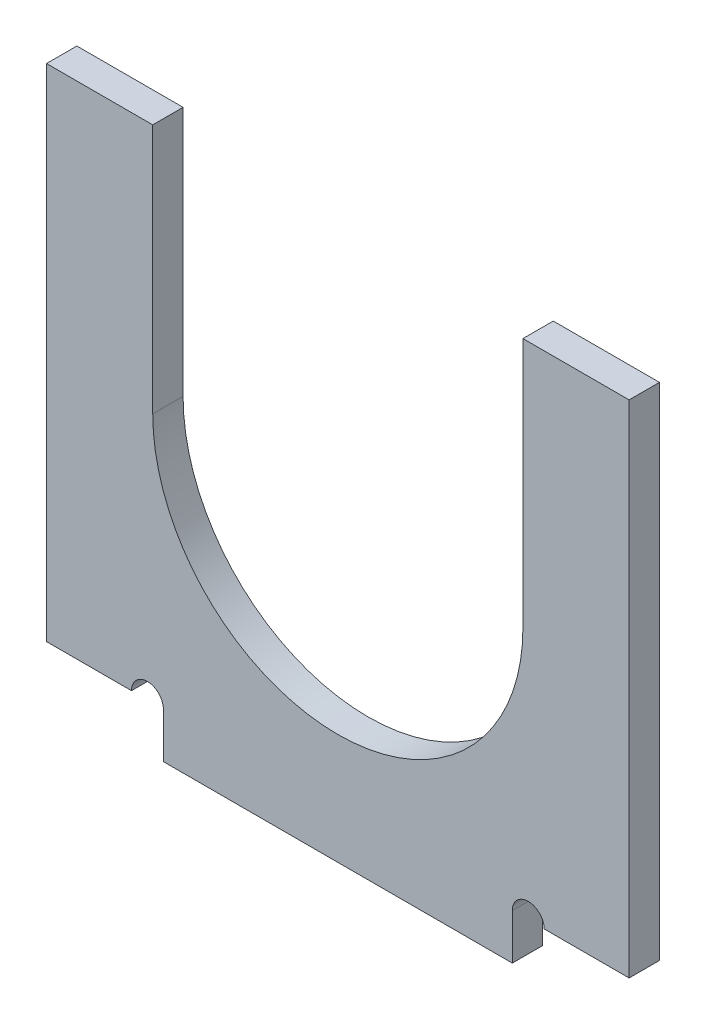
ISO-10303-21;
HEADER;
FILE_DESCRIPTION(('STEP AP214'),'2;1');
FILE_NAME('part.step','',(''),(''),'','','');
FILE_SCHEMA(('AUTOMOTIVE_DESIGN { 1 0 10303 214 1 1 1 1 }'));
ENDSEC;
DATA;
#1=APPLICATION_CONTEXT('core data for automotive mechanical design processes');
#2=APPLICATION_PROTOCOL_DEFINITION('international standard','automotive_design',2000,#1);
#3=PRODUCT_CONTEXT('',#1,'mechanical');
#4=PRODUCT('Part','Part','',(#3));
#5=PRODUCT_RELATED_PRODUCT_CATEGORY('part','',(#4));
#6=PRODUCT_DEFINITION_FORMATION('','',#4);
#7=PRODUCT_DEFINITION_CONTEXT('part definition',#1,'design');
#8=PRODUCT_DEFINITION('design','',#6,#7);
#9=PRODUCT_DEFINITION_SHAPE('','',#8);
#10=(LENGTH_UNIT() NAMED_UNIT(*) SI_UNIT(.MILLI.,.METRE.));
#11=(NAMED_UNIT(*) PLANE_ANGLE_UNIT() SI_UNIT($,.RADIAN.));
#12=(NAMED_UNIT(*) SI_UNIT($,.STERADIAN.) SOLID_ANGLE_UNIT());
#13=UNCERTAINTY_MEASURE_WITH_UNIT(LENGTH_MEASURE(1.E-05),#10,'distance_accuracy_value','');
#14=(GEOMETRIC_REPRESENTATION_CONTEXT(3) GLOBAL_UNCERTAINTY_ASSIGNED_CONTEXT((#13)) GLOBAL_UNIT_ASSIGNED_CONTEXT((#10,
#11,#12)) REPRESENTATION_CONTEXT('',''));
#15=CARTESIAN_POINT('',(0.,0.,0.));
#16=DIRECTION('',(0.,0.,1.));
#17=DIRECTION('',(1.,0.,0.));
#18=AXIS2_PLACEMENT_3D('',#15,#16,#17);
#19=CARTESIAN_POINT('',(-19.2,-15.,2.));
#20=DIRECTION('',(0.,1.,0.));
#21=DIRECTION('',(0.,0.,1.));
#22=AXIS2_PLACEMENT_3D('',#19,#20,#21);
#23=PLANE('',#22);
#24=DIRECTION('',(1.,0.,0.));
#25=VECTOR('',#24,1.);
#26=CARTESIAN_POINT('',(-19.2,-15.,0.));
#27=LINE('',#26,#25);
#28=CARTESIAN_POINT('',(-19.2,-15.,0.));
#29=VERTEX_POINT('',#28);
#30=CARTESIAN_POINT('',(-13.6,-15.,0.));
#31=VERTEX_POINT('',#30);
#32=EDGE_CURVE('E145',#29,#31,#27,.T.);
#33=ORIENTED_EDGE('',*,*,#32,.T.);
#34=DIRECTION('',(0.,0.,1.));
#35=VECTOR('',#34,1.);
#36=CARTESIAN_POINT('',(-13.6,-15.,-2.9698484809835));
#37=LINE('',#36,#35);
#38=CARTESIAN_POINT('',(-13.6,-15.,2.));
#39=VERTEX_POINT('',#38);
#40=EDGE_CURVE('E190',#31,#39,#37,.T.);
#41=ORIENTED_EDGE('',*,*,#40,.T.);
#42=DIRECTION('',(1.,0.,0.));
#43=VECTOR('',#42,1.);
#44=CARTESIAN_POINT('',(-19.2,-15.,2.));
#45=LINE('',#44,#43);
#46=CARTESIAN_POINT('',(-19.2,-15.,2.));
#47=VERTEX_POINT('',#46);
#48=EDGE_CURVE('E238',#47,#39,#45,.T.);
#49=ORIENTED_EDGE('',*,*,#48,.F.);
#50=DIRECTION('',(0.,0.,-1.));
#51=VECTOR('',#50,1.);
#52=CARTESIAN_POINT('',(-19.2,-15.,2.));
#53=LINE('',#52,#51);
#54=EDGE_CURVE('E11',#47,#29,#53,.T.);
#55=ORIENTED_EDGE('',*,*,#54,.T.);
#56=EDGE_LOOP('',(#33,#41,#49,#55));
#57=FACE_BOUND('',#56,.T.);
#58=ADVANCED_FACE('F35',(#57),#23,.F.);
#59=CARTESIAN_POINT('',(19.2,-15.,2.));
#60=DIRECTION('',(-1.,0.,0.));
#61=DIRECTION('',(0.,0.,1.));
#62=AXIS2_PLACEMENT_3D('',#59,#60,#61);
#63=PLANE('',#62);
#64=DIRECTION('',(0.,1.,0.));
#65=VECTOR('',#64,1.);
#66=CARTESIAN_POINT('',(19.2,-15.,0.));
#67=LINE('',#66,#65);
#68=CARTESIAN_POINT('',(19.2,-15.,0.));
#69=VERTEX_POINT('',#68);
#70=CARTESIAN_POINT('',(19.2,18.,0.));
#71=VERTEX_POINT('',#70);
#72=EDGE_CURVE('E149',#69,#71,#67,.T.);
#73=ORIENTED_EDGE('',*,*,#72,.T.);
#74=DIRECTION('',(0.,0.,-1.));
#75=VECTOR('',#74,1.);
#76=CARTESIAN_POINT('',(19.2,18.,9.61577310586392));
#77=LINE('',#76,#75);
#78=CARTESIAN_POINT('',(19.2,18.,2.));
#79=VERTEX_POINT('',#78);
#80=EDGE_CURVE('E172',#79,#71,#77,.T.);
#81=ORIENTED_EDGE('',*,*,#80,.F.);
#82=DIRECTION('',(0.,1.,0.));
#83=VECTOR('',#82,1.);
#84=CARTESIAN_POINT('',(19.2,-15.,2.));
#85=LINE('',#84,#83);
#86=CARTESIAN_POINT('',(19.2,-15.,2.));
#87=VERTEX_POINT('',#86);
#88=EDGE_CURVE('E234',#87,#79,#85,.T.);
#89=ORIENTED_EDGE('',*,*,#88,.F.);
#90=DIRECTION('',(0.,0.,-1.));
#91=VECTOR('',#90,1.);
#92=CARTESIAN_POINT('',(19.2,-15.,2.));
#93=LINE('',#92,#91);
#94=EDGE_CURVE('E43',#87,#69,#93,.T.);
#95=ORIENTED_EDGE('',*,*,#94,.T.);
#96=EDGE_LOOP('',(#73,#81,#89,#95));
#97=FACE_BOUND('',#96,.T.);
#98=ADVANCED_FACE('F37',(#97),#63,.F.);
#99=CARTESIAN_POINT('',(-19.2,-15.,2.));
#100=DIRECTION('',(1.,0.,0.));
#101=DIRECTION('',(0.,0.,-1.));
#102=AXIS2_PLACEMENT_3D('',#99,#100,#101);
#103=PLANE('',#102);
#104=DIRECTION('',(0.,-1.,0.));
#105=VECTOR('',#104,1.);
#106=CARTESIAN_POINT('',(-19.2,-15.,0.));
#107=LINE('',#106,#105);
#108=CARTESIAN_POINT('',(-19.2,18.,0.));
#109=VERTEX_POINT('',#108);
#110=EDGE_CURVE('E136',#109,#29,#107,.T.);
#111=ORIENTED_EDGE('',*,*,#110,.T.);
#112=ORIENTED_EDGE('',*,*,#54,.F.);
#113=DIRECTION('',(0.,-1.,0.));
#114=VECTOR('',#113,1.);
#115=CARTESIAN_POINT('',(-19.2,-15.,2.));
#116=LINE('',#115,#114);
#117=CARTESIAN_POINT('',(-19.2,18.,2.));
#118=VERTEX_POINT('',#117);
#119=EDGE_CURVE('E154',#118,#47,#116,.T.);
#120=ORIENTED_EDGE('',*,*,#119,.F.);
#121=DIRECTION('',(0.,0.,-1.));
#122=VECTOR('',#121,1.);
#123=CARTESIAN_POINT('',(-19.2,18.,9.61577310586392));
#124=LINE('',#123,#122);
#125=EDGE_CURVE('E152',#118,#109,#124,.T.);
#126=ORIENTED_EDGE('',*,*,#125,.T.);
#127=EDGE_LOOP('',(#111,#112,#120,#126));
#128=FACE_BOUND('',#127,.T.);
#129=ADVANCED_FACE('F153',(#128),#103,.F.);
#130=CARTESIAN_POINT('',(13.6,-15.,2.));
#131=VERTEX_POINT('',#130);
#132=EDGE_CURVE('E237',#131,#87,#45,.T.);
#133=ORIENTED_EDGE('',*,*,#132,.F.);
#134=DIRECTION('',(0.,0.,1.));
#135=VECTOR('',#134,1.);
#136=CARTESIAN_POINT('',(13.6,-15.,-2.9698484809835));
#137=LINE('',#136,#135);
#138=CARTESIAN_POINT('',(13.6,-15.,0.));
#139=VERTEX_POINT('',#138);
#140=EDGE_CURVE('E185',#131,#139,#137,.F.);
#141=ORIENTED_EDGE('',*,*,#140,.T.);
#142=EDGE_CURVE('E148',#139,#69,#27,.T.);
#143=ORIENTED_EDGE('',*,*,#142,.T.);
#144=ORIENTED_EDGE('',*,*,#94,.F.);
#145=EDGE_LOOP('',(#133,#141,#143,#144));
#146=FACE_BOUND('',#145,.T.);
#147=ADVANCED_FACE('F258',(#146),#23,.F.);
#148=CARTESIAN_POINT('',(0.,0.,2.));
#149=DIRECTION('',(0.,0.,-1.));
#150=DIRECTION('',(-1.,0.,0.));
#151=AXIS2_PLACEMENT_3D('',#148,#149,#150);
#152=PLANE('',#151);
#153=DIRECTION('',(0.,1.,0.));
#154=VECTOR('',#153,1.);
#155=CARTESIAN_POINT('',(11.5,-18.,2.));
#156=LINE('',#155,#154);
#157=CARTESIAN_POINT('',(11.5,-18.,2.));
#158=VERTEX_POINT('',#157);
#159=CARTESIAN_POINT('',(11.5,-15.,2.));
#160=VERTEX_POINT('',#159);
#161=EDGE_CURVE('E194',#158,#160,#156,.T.);
#162=ORIENTED_EDGE('',*,*,#161,.T.);
#163=CARTESIAN_POINT('',(12.55,-15.,2.));
#164=DIRECTION('',(0.,0.,1.));
#165=DIRECTION('',(1.,0.,0.));
#166=AXIS2_PLACEMENT_3D('',#163,#164,#165);
#167=CIRCLE('',#166,1.05);
#168=EDGE_CURVE('E50',#131,#160,#167,.T.);
#169=ORIENTED_EDGE('',*,*,#168,.F.);
#170=ORIENTED_EDGE('',*,*,#132,.T.);
#171=ORIENTED_EDGE('',*,*,#88,.T.);
#172=DIRECTION('',(-1.,0.,0.));
#173=VECTOR('',#172,1.);
#174=CARTESIAN_POINT('',(19.2,18.,2.));
#175=LINE('',#174,#173);
#176=CARTESIAN_POINT('',(12.2,18.,2.));
#177=VERTEX_POINT('',#176);
#178=EDGE_CURVE('E168',#79,#177,#175,.T.);
#179=ORIENTED_EDGE('',*,*,#178,.T.);
#180=DIRECTION('',(0.,-1.,0.));
#181=VECTOR('',#180,1.);
#182=CARTESIAN_POINT('',(12.2,1.50000000002853,2.));
#183=LINE('',#182,#181);
#184=CARTESIAN_POINT('',(12.2,1.50000000002853,2.));
#185=VERTEX_POINT('',#184);
#186=EDGE_CURVE('E222',#177,#185,#183,.T.);
#187=ORIENTED_EDGE('',*,*,#186,.T.);
#188=CARTESIAN_POINT('',(0.,1.50000000002853,2.));
#189=DIRECTION('',(0.,0.,-1.));
#190=DIRECTION('',(-1.,0.,0.));
#191=AXIS2_PLACEMENT_3D('',#188,#189,#190);
#192=CIRCLE('',#191,12.2);
#193=CARTESIAN_POINT('',(-12.2,1.50000000002853,2.));
#194=VERTEX_POINT('',#193);
#195=EDGE_CURVE('E216',#185,#194,#192,.T.);
#196=ORIENTED_EDGE('',*,*,#195,.T.);
#197=DIRECTION('',(0.,1.,0.));
#198=VECTOR('',#197,1.);
#199=CARTESIAN_POINT('',(-12.2,15.,2.));
#200=LINE('',#199,#198);
#201=CARTESIAN_POINT('',(-12.2,18.,2.));
#202=VERTEX_POINT('',#201);
#203=EDGE_CURVE('E219',#194,#202,#200,.T.);
#204=ORIENTED_EDGE('',*,*,#203,.T.);
#205=DIRECTION('',(-1.,0.,0.));
#206=VECTOR('',#205,1.);
#207=CARTESIAN_POINT('',(-12.2,18.,2.));
#208=LINE('',#207,#206);
#209=EDGE_CURVE('E166',#202,#118,#208,.T.);
#210=ORIENTED_EDGE('',*,*,#209,.T.);
#211=ORIENTED_EDGE('',*,*,#119,.T.);
#212=ORIENTED_EDGE('',*,*,#48,.T.);
#213=CARTESIAN_POINT('',(-12.55,-15.,2.));
#214=DIRECTION('',(0.,0.,1.));
#215=DIRECTION('',(1.,0.,0.));
#216=AXIS2_PLACEMENT_3D('',#213,#214,#215);
#217=CIRCLE('',#216,1.05);
#218=CARTESIAN_POINT('',(-11.5,-15.,2.));
#219=VERTEX_POINT('',#218);
#220=EDGE_CURVE('E171',#219,#39,#217,.T.);
#221=ORIENTED_EDGE('',*,*,#220,.F.);
#222=DIRECTION('',(0.,-1.,0.));
#223=VECTOR('',#222,1.);
#224=CARTESIAN_POINT('',(-11.5,-18.,2.));
#225=LINE('',#224,#223);
#226=CARTESIAN_POINT('',(-11.5,-18.,2.));
#227=VERTEX_POINT('',#226);
#228=EDGE_CURVE('E199',#219,#227,#225,.T.);
#229=ORIENTED_EDGE('',*,*,#228,.T.);
#230=DIRECTION('',(1.,0.,0.));
#231=VECTOR('',#230,1.);
#232=CARTESIAN_POINT('',(11.5,-18.,2.));
#233=LINE('',#232,#231);
#234=EDGE_CURVE('E196',#227,#158,#233,.T.);
#235=ORIENTED_EDGE('',*,*,#234,.T.);
#236=EDGE_LOOP('',(#162,#169,#170,#171,#179,#187,#196,#204,#210,#211,#212,#221,#229,#235));
#237=FACE_BOUND('',#236,.T.);
#238=ADVANCED_FACE('F257',(#237),#152,.F.);
#239=CARTESIAN_POINT('',(0.,0.,0.));
#240=DIRECTION('',(0.,0.,-1.));
#241=DIRECTION('',(-1.,0.,0.));
#242=AXIS2_PLACEMENT_3D('',#239,#240,#241);
#243=PLANE('',#242);
#244=CARTESIAN_POINT('',(12.55,-15.,0.));
#245=DIRECTION('',(0.,0.,-1.));
#246=DIRECTION('',(-1.,0.,0.));
#247=AXIS2_PLACEMENT_3D('',#244,#245,#246);
#248=CIRCLE('',#247,1.05);
#249=CARTESIAN_POINT('',(11.5,-15.,0.));
#250=VERTEX_POINT('',#249);
#251=EDGE_CURVE('E182',#139,#250,#248,.F.);
#252=ORIENTED_EDGE('',*,*,#251,.T.);
#253=DIRECTION('',(0.,-1.,0.));
#254=VECTOR('',#253,1.);
#255=CARTESIAN_POINT('',(11.5,-18.,0.));
#256=LINE('',#255,#254);
#257=CARTESIAN_POINT('',(11.5,-18.,0.));
#258=VERTEX_POINT('',#257);
#259=EDGE_CURVE('E204',#250,#258,#256,.T.);
#260=ORIENTED_EDGE('',*,*,#259,.T.);
#261=DIRECTION('',(-1.,0.,0.));
#262=VECTOR('',#261,1.);
#263=CARTESIAN_POINT('',(11.5,-18.,0.));
#264=LINE('',#263,#262);
#265=CARTESIAN_POINT('',(-11.5,-18.,0.));
#266=VERTEX_POINT('',#265);
#267=EDGE_CURVE('E206',#258,#266,#264,.T.);
#268=ORIENTED_EDGE('',*,*,#267,.T.);
#269=DIRECTION('',(0.,1.,0.));
#270=VECTOR('',#269,1.);
#271=CARTESIAN_POINT('',(-11.5,-18.,0.));
#272=LINE('',#271,#270);
#273=CARTESIAN_POINT('',(-11.5,-15.,0.));
#274=VERTEX_POINT('',#273);
#275=EDGE_CURVE('E193',#266,#274,#272,.T.);
#276=ORIENTED_EDGE('',*,*,#275,.T.);
#277=CARTESIAN_POINT('',(-12.55,-15.,0.));
#278=DIRECTION('',(0.,0.,-1.));
#279=DIRECTION('',(-1.,0.,0.));
#280=AXIS2_PLACEMENT_3D('',#277,#278,#279);
#281=CIRCLE('',#280,1.05);
#282=EDGE_CURVE('E183',#274,#31,#281,.F.);
#283=ORIENTED_EDGE('',*,*,#282,.T.);
#284=ORIENTED_EDGE('',*,*,#32,.F.);
#285=ORIENTED_EDGE('',*,*,#110,.F.);
#286=DIRECTION('',(1.,0.,0.));
#287=VECTOR('',#286,1.);
#288=CARTESIAN_POINT('',(-12.2,18.,0.));
#289=LINE('',#288,#287);
#290=CARTESIAN_POINT('',(-12.2,18.,0.));
#291=VERTEX_POINT('',#290);
#292=EDGE_CURVE('E142',#109,#291,#289,.T.);
#293=ORIENTED_EDGE('',*,*,#292,.T.);
#294=DIRECTION('',(0.,1.,0.));
#295=VECTOR('',#294,1.);
#296=CARTESIAN_POINT('',(-12.2,15.,0.));
#297=LINE('',#296,#295);
#298=CARTESIAN_POINT('',(-12.2,1.50000000002853,0.));
#299=VERTEX_POINT('',#298);
#300=EDGE_CURVE('E227',#299,#291,#297,.T.);
#301=ORIENTED_EDGE('',*,*,#300,.F.);
#302=CARTESIAN_POINT('',(0.,1.50000000002853,0.));
#303=DIRECTION('',(0.,0.,-1.));
#304=DIRECTION('',(-1.,0.,0.));
#305=AXIS2_PLACEMENT_3D('',#302,#303,#304);
#306=CIRCLE('',#305,12.2);
#307=CARTESIAN_POINT('',(12.2,1.50000000002853,0.));
#308=VERTEX_POINT('',#307);
#309=EDGE_CURVE('E58',#308,#299,#306,.T.);
#310=ORIENTED_EDGE('',*,*,#309,.F.);
#311=DIRECTION('',(0.,-1.,0.));
#312=VECTOR('',#311,1.);
#313=CARTESIAN_POINT('',(12.2,1.50000000002853,0.));
#314=LINE('',#313,#312);
#315=CARTESIAN_POINT('',(12.2,18.,0.));
#316=VERTEX_POINT('',#315);
#317=EDGE_CURVE('E220',#316,#308,#314,.T.);
#318=ORIENTED_EDGE('',*,*,#317,.F.);
#319=DIRECTION('',(1.,0.,0.));
#320=VECTOR('',#319,1.);
#321=CARTESIAN_POINT('',(19.2,18.,0.));
#322=LINE('',#321,#320);
#323=EDGE_CURVE('E173',#316,#71,#322,.T.);
#324=ORIENTED_EDGE('',*,*,#323,.T.);
#325=ORIENTED_EDGE('',*,*,#72,.F.);
#326=ORIENTED_EDGE('',*,*,#142,.F.);
#327=EDGE_LOOP('',(#252,#260,#268,#276,#283,#284,#285,#293,#301,#310,#318,#324,#325,#326));
#328=FACE_BOUND('',#327,.T.);
#329=ADVANCED_FACE('F139',(#328),#243,.T.);
#330=CARTESIAN_POINT('',(0.,1.50000000002853,2.));
#331=DIRECTION('',(0.,0.,-1.));
#332=DIRECTION('',(-1.,0.,0.));
#333=AXIS2_PLACEMENT_3D('',#330,#331,#332);
#334=CYLINDRICAL_SURFACE('',#333,12.2);
#335=ORIENTED_EDGE('',*,*,#309,.T.);
#336=DIRECTION('',(0.,0.,-1.));
#337=VECTOR('',#336,1.);
#338=CARTESIAN_POINT('',(-12.2,1.50000000002853,2.));
#339=LINE('',#338,#337);
#340=EDGE_CURVE('E225',#194,#299,#339,.T.);
#341=ORIENTED_EDGE('',*,*,#340,.F.);
#342=ORIENTED_EDGE('',*,*,#195,.F.);
#343=DIRECTION('',(0.,0.,-1.));
#344=VECTOR('',#343,1.);
#345=CARTESIAN_POINT('',(12.2,1.50000000002853,2.));
#346=LINE('',#345,#344);
#347=EDGE_CURVE('E231',#185,#308,#346,.T.);
#348=ORIENTED_EDGE('',*,*,#347,.T.);
#349=EDGE_LOOP('',(#335,#341,#342,#348));
#350=FACE_BOUND('',#349,.T.);
#351=ADVANCED_FACE('F310',(#350),#334,.F.);
#352=CARTESIAN_POINT('',(12.2,1.50000000002853,2.));
#353=DIRECTION('',(1.,0.,0.));
#354=DIRECTION('',(0.,0.,-1.));
#355=AXIS2_PLACEMENT_3D('',#352,#353,#354);
#356=PLANE('',#355);
#357=ORIENTED_EDGE('',*,*,#317,.T.);
#358=ORIENTED_EDGE('',*,*,#347,.F.);
#359=ORIENTED_EDGE('',*,*,#186,.F.);
#360=DIRECTION('',(0.,0.,-1.));
#361=VECTOR('',#360,1.);
#362=CARTESIAN_POINT('',(12.2,18.,9.61577310586392));
#363=LINE('',#362,#361);
#364=EDGE_CURVE('E176',#177,#316,#363,.T.);
#365=ORIENTED_EDGE('',*,*,#364,.T.);
#366=EDGE_LOOP('',(#357,#358,#359,#365));
#367=FACE_BOUND('',#366,.T.);
#368=ADVANCED_FACE('F317',(#367),#356,.F.);
#369=CARTESIAN_POINT('',(-12.2,15.,2.));
#370=DIRECTION('',(-1.,0.,0.));
#371=DIRECTION('',(0.,0.,1.));
#372=AXIS2_PLACEMENT_3D('',#369,#370,#371);
#373=PLANE('',#372);
#374=ORIENTED_EDGE('',*,*,#300,.T.);
#375=DIRECTION('',(0.,0.,-1.));
#376=VECTOR('',#375,1.);
#377=CARTESIAN_POINT('',(-12.2,18.,9.61577310586392));
#378=LINE('',#377,#376);
#379=EDGE_CURVE('E158',#202,#291,#378,.T.);
#380=ORIENTED_EDGE('',*,*,#379,.F.);
#381=ORIENTED_EDGE('',*,*,#203,.F.);
#382=ORIENTED_EDGE('',*,*,#340,.T.);
#383=EDGE_LOOP('',(#374,#380,#381,#382));
#384=FACE_BOUND('',#383,.T.);
#385=ADVANCED_FACE('F323',(#384),#373,.F.);
#386=CARTESIAN_POINT('',(-11.5,-18.,25.7697286480094));
#387=DIRECTION('',(-1.,0.,0.));
#388=DIRECTION('',(0.,-1.,0.));
#389=AXIS2_PLACEMENT_3D('',#386,#387,#388);
#390=PLANE('',#389);
#391=DIRECTION('',(0.,0.,1.));
#392=VECTOR('',#391,1.);
#393=CARTESIAN_POINT('',(-11.5,-15.,2.));
#394=LINE('',#393,#392);
#395=EDGE_CURVE('E214',#274,#219,#394,.T.);
#396=ORIENTED_EDGE('',*,*,#395,.F.);
#397=ORIENTED_EDGE('',*,*,#275,.F.);
#398=DIRECTION('',(0.,0.,-1.));
#399=VECTOR('',#398,1.);
#400=CARTESIAN_POINT('',(-11.5,-18.,25.7697286480094));
#401=LINE('',#400,#399);
#402=EDGE_CURVE('E197',#227,#266,#401,.T.);
#403=ORIENTED_EDGE('',*,*,#402,.F.);
#404=ORIENTED_EDGE('',*,*,#228,.F.);
#405=EDGE_LOOP('',(#396,#397,#403,#404));
#406=FACE_BOUND('',#405,.T.);
#407=ADVANCED_FACE('F274',(#406),#390,.T.);
#408=CARTESIAN_POINT('',(11.5,-18.,25.7697286480094));
#409=DIRECTION('',(1.,0.,0.));
#410=DIRECTION('',(0.,1.,0.));
#411=AXIS2_PLACEMENT_3D('',#408,#409,#410);
#412=PLANE('',#411);
#413=DIRECTION('',(0.,0.,-1.));
#414=VECTOR('',#413,1.);
#415=CARTESIAN_POINT('',(11.5,-15.,2.));
#416=LINE('',#415,#414);
#417=EDGE_CURVE('E201',#160,#250,#416,.T.);
#418=ORIENTED_EDGE('',*,*,#417,.F.);
#419=ORIENTED_EDGE('',*,*,#161,.F.);
#420=DIRECTION('',(0.,0.,-1.));
#421=VECTOR('',#420,1.);
#422=CARTESIAN_POINT('',(11.5,-18.,25.7697286480094));
#423=LINE('',#422,#421);
#424=EDGE_CURVE('E209',#158,#258,#423,.T.);
#425=ORIENTED_EDGE('',*,*,#424,.T.);
#426=ORIENTED_EDGE('',*,*,#259,.F.);
#427=EDGE_LOOP('',(#418,#419,#425,#426));
#428=FACE_BOUND('',#427,.T.);
#429=ADVANCED_FACE('F263',(#428),#412,.T.);
#430=CARTESIAN_POINT('',(11.5,-18.,25.7697286480094));
#431=DIRECTION('',(0.,-1.,0.));
#432=DIRECTION('',(0.,0.,-1.));
#433=AXIS2_PLACEMENT_3D('',#430,#431,#432);
#434=PLANE('',#433);
#435=ORIENTED_EDGE('',*,*,#234,.F.);
#436=ORIENTED_EDGE('',*,*,#402,.T.);
#437=ORIENTED_EDGE('',*,*,#267,.F.);
#438=ORIENTED_EDGE('',*,*,#424,.F.);
#439=EDGE_LOOP('',(#435,#436,#437,#438));
#440=FACE_BOUND('',#439,.T.);
#441=ADVANCED_FACE('F269',(#440),#434,.T.);
#442=CARTESIAN_POINT('',(12.55,-15.,-2.9698484809835));
#443=DIRECTION('',(0.,0.,1.));
#444=DIRECTION('',(1.,0.,0.));
#445=AXIS2_PLACEMENT_3D('',#442,#443,#444);
#446=CYLINDRICAL_SURFACE('',#445,1.05);
#447=ORIENTED_EDGE('',*,*,#168,.T.);
#448=ORIENTED_EDGE('',*,*,#417,.T.);
#449=ORIENTED_EDGE('',*,*,#251,.F.);
#450=ORIENTED_EDGE('',*,*,#140,.F.);
#451=EDGE_LOOP('',(#447,#448,#449,#450));
#452=FACE_BOUND('',#451,.T.);
#453=ADVANCED_FACE('F259',(#452),#446,.F.);
#454=CARTESIAN_POINT('',(-12.55,-15.,-2.9698484809835));
#455=DIRECTION('',(0.,0.,1.));
#456=DIRECTION('',(1.,0.,0.));
#457=AXIS2_PLACEMENT_3D('',#454,#455,#456);
#458=CYLINDRICAL_SURFACE('',#457,1.05);
#459=ORIENTED_EDGE('',*,*,#282,.F.);
#460=ORIENTED_EDGE('',*,*,#395,.T.);
#461=ORIENTED_EDGE('',*,*,#220,.T.);
#462=ORIENTED_EDGE('',*,*,#40,.F.);
#463=EDGE_LOOP('',(#459,#460,#461,#462));
#464=FACE_BOUND('',#463,.T.);
#465=ADVANCED_FACE('F278',(#464),#458,.F.);
#466=CARTESIAN_POINT('',(19.2,18.,9.61577310586392));
#467=DIRECTION('',(0.,1.,0.));
#468=DIRECTION('',(0.,0.,1.));
#469=AXIS2_PLACEMENT_3D('',#466,#467,#468);
#470=PLANE('',#469);
#471=ORIENTED_EDGE('',*,*,#178,.F.);
#472=ORIENTED_EDGE('',*,*,#80,.T.);
#473=ORIENTED_EDGE('',*,*,#323,.F.);
#474=ORIENTED_EDGE('',*,*,#364,.F.);
#475=EDGE_LOOP('',(#471,#472,#473,#474));
#476=FACE_BOUND('',#475,.T.);
#477=ADVANCED_FACE('F255',(#476),#470,.T.);
#478=CARTESIAN_POINT('',(-12.2,18.,9.61577310586392));
#479=DIRECTION('',(0.,1.,0.));
#480=DIRECTION('',(0.,0.,1.));
#481=AXIS2_PLACEMENT_3D('',#478,#479,#480);
#482=PLANE('',#481);
#483=ORIENTED_EDGE('',*,*,#209,.F.);
#484=ORIENTED_EDGE('',*,*,#379,.T.);
#485=ORIENTED_EDGE('',*,*,#292,.F.);
#486=ORIENTED_EDGE('',*,*,#125,.F.);
#487=EDGE_LOOP('',(#483,#484,#485,#486));
#488=FACE_BOUND('',#487,.T.);
#489=ADVANCED_FACE('F161',(#488),#482,.T.);
#490=CLOSED_SHELL('',(#58,#98,#129,#147,#238,#329,#351,#368,#385,#407,#429,#441,#453,#465,#477,#489));
#491=MANIFOLD_SOLID_BREP('B2',#490);
#492=ADVANCED_BREP_SHAPE_REPRESENTATION('',(#18,#491),#14);
#493=SHAPE_DEFINITION_REPRESENTATION(#9,#492);
ENDSEC;
END-ISO-10303-21;
